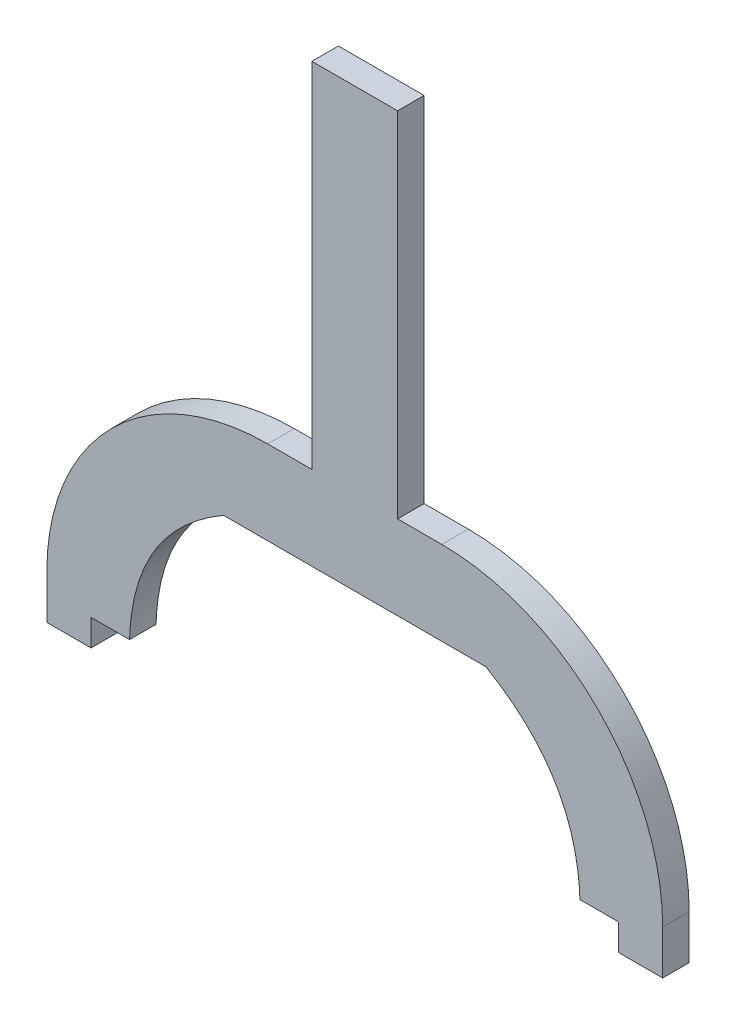
ISO-10303-21;
HEADER;
FILE_DESCRIPTION(('STEP AP214'),'2;1');
FILE_NAME('part.step','',(''),(''),'','','');
FILE_SCHEMA(('AUTOMOTIVE_DESIGN { 1 0 10303 214 1 1 1 1 }'));
ENDSEC;
DATA;
#1=APPLICATION_CONTEXT('core data for automotive mechanical design processes');
#2=APPLICATION_PROTOCOL_DEFINITION('international standard','automotive_design',2000,#1);
#3=PRODUCT_CONTEXT('',#1,'mechanical');
#4=PRODUCT('Part','Part','',(#3));
#5=PRODUCT_RELATED_PRODUCT_CATEGORY('part','',(#4));
#6=PRODUCT_DEFINITION_FORMATION('','',#4);
#7=PRODUCT_DEFINITION_CONTEXT('part definition',#1,'design');
#8=PRODUCT_DEFINITION('design','',#6,#7);
#9=PRODUCT_DEFINITION_SHAPE('','',#8);
#10=(LENGTH_UNIT() NAMED_UNIT(*) SI_UNIT(.MILLI.,.METRE.));
#11=(NAMED_UNIT(*) PLANE_ANGLE_UNIT() SI_UNIT($,.RADIAN.));
#12=(NAMED_UNIT(*) SI_UNIT($,.STERADIAN.) SOLID_ANGLE_UNIT());
#13=UNCERTAINTY_MEASURE_WITH_UNIT(LENGTH_MEASURE(1.E-05),#10,'distance_accuracy_value','');
#14=(GEOMETRIC_REPRESENTATION_CONTEXT(3) GLOBAL_UNCERTAINTY_ASSIGNED_CONTEXT((#13)) GLOBAL_UNIT_ASSIGNED_CONTEXT((#10,
#11,#12)) REPRESENTATION_CONTEXT('',''));
#15=CARTESIAN_POINT('',(0.,0.,0.));
#16=DIRECTION('',(0.,0.,1.));
#17=DIRECTION('',(1.,0.,0.));
#18=AXIS2_PLACEMENT_3D('',#15,#16,#17);
#19=CARTESIAN_POINT('',(37.7157739337465,-119.38,7.62));
#20=DIRECTION('',(0.,1.,0.));
#21=DIRECTION('',(0.,0.,1.));
#22=AXIS2_PLACEMENT_3D('',#19,#20,#21);
#23=PLANE('',#22);
#24=DIRECTION('',(0.,0.,1.));
#25=VECTOR('',#24,1.);
#26=CARTESIAN_POINT('',(64.7356154265762,-119.38,0.));
#27=LINE('',#26,#25);
#28=CARTESIAN_POINT('',(64.7356154265762,-119.38,0.));
#29=VERTEX_POINT('',#28);
#30=CARTESIAN_POINT('',(64.7356154265762,-119.38,7.62));
#31=VERTEX_POINT('',#30);
#32=EDGE_CURVE('E160',#29,#31,#27,.T.);
#33=ORIENTED_EDGE('',*,*,#32,.F.);
#34=DIRECTION('',(1.,0.,0.));
#35=VECTOR('',#34,1.);
#36=CARTESIAN_POINT('',(37.7157739337465,-119.38,0.));
#37=LINE('',#36,#35);
#38=CARTESIAN_POINT('',(75.8157739337465,-119.38,0.));
#39=VERTEX_POINT('',#38);
#40=EDGE_CURVE('E173',#29,#39,#37,.T.);
#41=ORIENTED_EDGE('',*,*,#40,.T.);
#42=DIRECTION('',(0.,0.,-1.));
#43=VECTOR('',#42,1.);
#44=CARTESIAN_POINT('',(75.8157739337465,-119.38,7.62));
#45=LINE('',#44,#43);
#46=CARTESIAN_POINT('',(75.8157739337465,-119.38,7.62));
#47=VERTEX_POINT('',#46);
#48=EDGE_CURVE('E207',#47,#39,#45,.T.);
#49=ORIENTED_EDGE('',*,*,#48,.F.);
#50=DIRECTION('',(1.,0.,0.));
#51=VECTOR('',#50,1.);
#52=CARTESIAN_POINT('',(37.7157739337465,-119.38,7.62));
#53=LINE('',#52,#51);
#54=EDGE_CURVE('E175',#31,#47,#53,.T.);
#55=ORIENTED_EDGE('',*,*,#54,.F.);
#56=EDGE_LOOP('',(#33,#41,#49,#55));
#57=FACE_BOUND('',#56,.T.);
#58=ADVANCED_FACE('F33',(#57),#23,.F.);
#59=CARTESIAN_POINT('',(0.,0.,7.62));
#60=DIRECTION('',(0.,0.,-1.));
#61=DIRECTION('',(-1.,0.,0.));
#62=AXIS2_PLACEMENT_3D('',#59,#60,#61);
#63=PLANE('',#62);
#64=CARTESIAN_POINT('',(37.7157739337465,-74.93,7.62));
#65=CARTESIAN_POINT('',(63.8441832928595,-90.0732647650582,7.62));
#66=CARTESIAN_POINT('',(64.7356154265762,-119.38,7.62));
#67=B_SPLINE_CURVE_WITH_KNOTS('',2,(#64,#65,#66),.UNSPECIFIED.,.F.,.F.,(3,3),(0.,1.),.UNSPECIFIED.);
#68=CARTESIAN_POINT('',(37.7157739337465,-74.93,7.62));
#69=VERTEX_POINT('',#68);
#70=EDGE_CURVE('E168',#69,#31,#67,.T.);
#71=ORIENTED_EDGE('',*,*,#70,.T.);
#72=ORIENTED_EDGE('',*,*,#54,.T.);
#73=DIRECTION('',(0.,-1.,0.));
#74=VECTOR('',#73,1.);
#75=CARTESIAN_POINT('',(75.8157739337465,-119.38,7.62));
#76=LINE('',#75,#74);
#77=CARTESIAN_POINT('',(75.8157739337465,-127.,7.62));
#78=VERTEX_POINT('',#77);
#79=EDGE_CURVE('E393',#47,#78,#76,.T.);
#80=ORIENTED_EDGE('',*,*,#79,.T.);
#81=DIRECTION('',(1.,0.,0.));
#82=VECTOR('',#81,1.);
#83=CARTESIAN_POINT('',(75.8157739337465,-127.,7.62));
#84=LINE('',#83,#82);
#85=CARTESIAN_POINT('',(88.5157739337465,-127.,7.62));
#86=VERTEX_POINT('',#85);
#87=EDGE_CURVE('E362',#78,#86,#84,.T.);
#88=ORIENTED_EDGE('',*,*,#87,.T.);
#89=DIRECTION('',(0.,1.,0.));
#90=VECTOR('',#89,1.);
#91=CARTESIAN_POINT('',(88.5157739337465,-50.8,7.62));
#92=LINE('',#91,#90);
#93=CARTESIAN_POINT('',(88.5157739337465,-114.3,7.62));
#94=VERTEX_POINT('',#93);
#95=EDGE_CURVE('E358',#86,#94,#92,.T.);
#96=ORIENTED_EDGE('',*,*,#95,.T.);
#97=CARTESIAN_POINT('',(25.0157739337465,-114.3,7.62));
#98=DIRECTION('',(0.,0.,-1.));
#99=DIRECTION('',(-1.,0.,0.));
#100=AXIS2_PLACEMENT_3D('',#97,#98,#99);
#101=CIRCLE('',#100,63.5);
#102=CARTESIAN_POINT('',(25.0157739337465,-50.8,7.62));
#103=VERTEX_POINT('',#102);
#104=EDGE_CURVE('E241',#94,#103,#101,.F.);
#105=ORIENTED_EDGE('',*,*,#104,.T.);
#106=DIRECTION('',(-1.,0.,0.));
#107=VECTOR('',#106,1.);
#108=CARTESIAN_POINT('',(12.3157739337465,-50.8,7.62));
#109=LINE('',#108,#107);
#110=CARTESIAN_POINT('',(12.3157739337465,-50.8,7.62));
#111=VERTEX_POINT('',#110);
#112=EDGE_CURVE('E201',#103,#111,#109,.T.);
#113=ORIENTED_EDGE('',*,*,#112,.T.);
#114=DIRECTION('',(0.,1.,0.));
#115=VECTOR('',#114,1.);
#116=CARTESIAN_POINT('',(12.3157739337465,-50.8,7.62));
#117=LINE('',#116,#115);
#118=CARTESIAN_POINT('',(12.3157739337465,50.8,7.62));
#119=VERTEX_POINT('',#118);
#120=EDGE_CURVE('E196',#111,#119,#117,.T.);
#121=ORIENTED_EDGE('',*,*,#120,.T.);
#122=DIRECTION('',(-1.,0.,0.));
#123=VECTOR('',#122,1.);
#124=CARTESIAN_POINT('',(-12.3157739337465,50.8,7.62));
#125=LINE('',#124,#123);
#126=CARTESIAN_POINT('',(-12.3157739337465,50.8,7.62));
#127=VERTEX_POINT('',#126);
#128=EDGE_CURVE('E380',#119,#127,#125,.T.);
#129=ORIENTED_EDGE('',*,*,#128,.T.);
#130=DIRECTION('',(0.,-1.,0.));
#131=VECTOR('',#130,1.);
#132=CARTESIAN_POINT('',(-12.3157739337465,-50.8,7.62));
#133=LINE('',#132,#131);
#134=CARTESIAN_POINT('',(-12.3157739337465,-50.8,7.62));
#135=VERTEX_POINT('',#134);
#136=EDGE_CURVE('E376',#127,#135,#133,.T.);
#137=ORIENTED_EDGE('',*,*,#136,.T.);
#138=DIRECTION('',(-1.,0.,0.));
#139=VECTOR('',#138,1.);
#140=CARTESIAN_POINT('',(-88.5157739337465,-50.8,7.62));
#141=LINE('',#140,#139);
#142=CARTESIAN_POINT('',(-25.0157739337465,-50.8,7.62));
#143=VERTEX_POINT('',#142);
#144=EDGE_CURVE('E375',#135,#143,#141,.T.);
#145=ORIENTED_EDGE('',*,*,#144,.T.);
#146=CARTESIAN_POINT('',(-25.0157739337465,-114.3,7.62));
#147=DIRECTION('',(0.,0.,-1.));
#148=DIRECTION('',(-1.,0.,0.));
#149=AXIS2_PLACEMENT_3D('',#146,#147,#148);
#150=CIRCLE('',#149,63.5);
#151=CARTESIAN_POINT('',(-88.5157739337465,-114.3,7.62));
#152=VERTEX_POINT('',#151);
#153=EDGE_CURVE('E56',#143,#152,#150,.F.);
#154=ORIENTED_EDGE('',*,*,#153,.T.);
#155=DIRECTION('',(0.,-1.,0.));
#156=VECTOR('',#155,1.);
#157=CARTESIAN_POINT('',(-88.5157739337465,-127.,7.62));
#158=LINE('',#157,#156);
#159=CARTESIAN_POINT('',(-88.5157739337465,-127.,7.62));
#160=VERTEX_POINT('',#159);
#161=EDGE_CURVE('E249',#152,#160,#158,.T.);
#162=ORIENTED_EDGE('',*,*,#161,.T.);
#163=DIRECTION('',(1.,0.,0.));
#164=VECTOR('',#163,1.);
#165=CARTESIAN_POINT('',(-88.5157739337465,-127.,7.62));
#166=LINE('',#165,#164);
#167=CARTESIAN_POINT('',(-75.8157739337465,-127.,7.62));
#168=VERTEX_POINT('',#167);
#169=EDGE_CURVE('E378',#160,#168,#166,.T.);
#170=ORIENTED_EDGE('',*,*,#169,.T.);
#171=DIRECTION('',(0.,1.,0.));
#172=VECTOR('',#171,1.);
#173=CARTESIAN_POINT('',(-75.8157739337465,-127.,7.62));
#174=LINE('',#173,#172);
#175=CARTESIAN_POINT('',(-75.8157739337465,-119.38,7.62));
#176=VERTEX_POINT('',#175);
#177=EDGE_CURVE('E385',#168,#176,#174,.T.);
#178=ORIENTED_EDGE('',*,*,#177,.T.);
#179=DIRECTION('',(1.,0.,0.));
#180=VECTOR('',#179,1.);
#181=CARTESIAN_POINT('',(-75.8157739337465,-119.38,7.62));
#182=LINE('',#181,#180);
#183=CARTESIAN_POINT('',(-64.7356154265761,-119.38,7.62));
#184=VERTEX_POINT('',#183);
#185=EDGE_CURVE('E387',#176,#184,#182,.T.);
#186=ORIENTED_EDGE('',*,*,#185,.T.);
#187=CARTESIAN_POINT('',(-37.7157739337465,-74.93,7.62));
#188=CARTESIAN_POINT('',(-63.8441832928595,-90.0732647650582,7.62));
#189=CARTESIAN_POINT('',(-64.7356154265761,-119.38,7.62));
#190=B_SPLINE_CURVE_WITH_KNOTS('',2,(#187,#188,#189),.UNSPECIFIED.,.F.,.F.,(3,3),(0.,1.),.UNSPECIFIED.);
#191=CARTESIAN_POINT('',(-37.7157739337465,-74.93,7.62));
#192=VERTEX_POINT('',#191);
#193=EDGE_CURVE('E176',#192,#184,#190,.T.);
#194=ORIENTED_EDGE('',*,*,#193,.F.);
#195=DIRECTION('',(1.,0.,0.));
#196=VECTOR('',#195,1.);
#197=CARTESIAN_POINT('',(37.7157739337465,-74.93,7.62));
#198=LINE('',#197,#196);
#199=EDGE_CURVE('E389',#192,#69,#198,.T.);
#200=ORIENTED_EDGE('',*,*,#199,.T.);
#201=EDGE_LOOP('',(#71,#72,#80,#88,#96,#105,#113,#121,#129,#137,#145,#154,#162,#170,#178,#186,
#194,#200));
#202=FACE_BOUND('',#201,.T.);
#203=ADVANCED_FACE('F290',(#202),#63,.F.);
#204=CARTESIAN_POINT('',(0.,0.,0.));
#205=DIRECTION('',(0.,0.,-1.));
#206=DIRECTION('',(-1.,0.,0.));
#207=AXIS2_PLACEMENT_3D('',#204,#205,#206);
#208=PLANE('',#207);
#209=ORIENTED_EDGE('',*,*,#40,.F.);
#210=CARTESIAN_POINT('',(37.7157739337465,-74.93,0.));
#211=CARTESIAN_POINT('',(63.8441832928595,-90.0732647650582,0.));
#212=CARTESIAN_POINT('',(64.7356154265762,-119.38,0.));
#213=B_SPLINE_CURVE_WITH_KNOTS('',2,(#210,#211,#212),.UNSPECIFIED.,.F.,.F.,(3,3),(0.,1.),.UNSPECIFIED.);
#214=CARTESIAN_POINT('',(37.7157739337465,-74.93,0.));
#215=VERTEX_POINT('',#214);
#216=EDGE_CURVE('E157',#215,#29,#213,.T.);
#217=ORIENTED_EDGE('',*,*,#216,.F.);
#218=DIRECTION('',(1.,0.,0.));
#219=VECTOR('',#218,1.);
#220=CARTESIAN_POINT('',(37.7157739337465,-74.93,0.));
#221=LINE('',#220,#219);
#222=CARTESIAN_POINT('',(-37.7157739337465,-74.93,0.));
#223=VERTEX_POINT('',#222);
#224=EDGE_CURVE('E182',#223,#215,#221,.T.);
#225=ORIENTED_EDGE('',*,*,#224,.F.);
#226=CARTESIAN_POINT('',(-37.7157739337465,-74.93,0.));
#227=CARTESIAN_POINT('',(-63.8441832928595,-90.0732647650582,0.));
#228=CARTESIAN_POINT('',(-64.7356154265761,-119.38,0.));
#229=B_SPLINE_CURVE_WITH_KNOTS('',2,(#226,#227,#228),.UNSPECIFIED.,.F.,.F.,(3,3),(0.,1.),.UNSPECIFIED.);
#230=CARTESIAN_POINT('',(-64.7356154265761,-119.38,0.));
#231=VERTEX_POINT('',#230);
#232=EDGE_CURVE('E271',#223,#231,#229,.T.);
#233=ORIENTED_EDGE('',*,*,#232,.T.);
#234=DIRECTION('',(1.,0.,0.));
#235=VECTOR('',#234,1.);
#236=CARTESIAN_POINT('',(-75.8157739337465,-119.38,0.));
#237=LINE('',#236,#235);
#238=CARTESIAN_POINT('',(-75.8157739337465,-119.38,0.));
#239=VERTEX_POINT('',#238);
#240=EDGE_CURVE('E186',#239,#231,#237,.T.);
#241=ORIENTED_EDGE('',*,*,#240,.F.);
#242=DIRECTION('',(0.,1.,0.));
#243=VECTOR('',#242,1.);
#244=CARTESIAN_POINT('',(-75.8157739337465,-127.,0.));
#245=LINE('',#244,#243);
#246=CARTESIAN_POINT('',(-75.8157739337465,-127.,0.));
#247=VERTEX_POINT('',#246);
#248=EDGE_CURVE('E258',#247,#239,#245,.T.);
#249=ORIENTED_EDGE('',*,*,#248,.F.);
#250=DIRECTION('',(1.,0.,0.));
#251=VECTOR('',#250,1.);
#252=CARTESIAN_POINT('',(-88.5157739337465,-127.,0.));
#253=LINE('',#252,#251);
#254=CARTESIAN_POINT('',(-88.5157739337465,-127.,0.));
#255=VERTEX_POINT('',#254);
#256=EDGE_CURVE('E255',#255,#247,#253,.T.);
#257=ORIENTED_EDGE('',*,*,#256,.F.);
#258=DIRECTION('',(0.,-1.,0.));
#259=VECTOR('',#258,1.);
#260=CARTESIAN_POINT('',(-88.5157739337465,-127.,0.));
#261=LINE('',#260,#259);
#262=CARTESIAN_POINT('',(-88.5157739337465,-114.3,0.));
#263=VERTEX_POINT('',#262);
#264=EDGE_CURVE('E248',#263,#255,#261,.T.);
#265=ORIENTED_EDGE('',*,*,#264,.F.);
#266=CARTESIAN_POINT('',(-25.0157739337465,-114.3,0.));
#267=DIRECTION('',(0.,0.,-1.));
#268=DIRECTION('',(-1.,0.,0.));
#269=AXIS2_PLACEMENT_3D('',#266,#267,#268);
#270=CIRCLE('',#269,63.5);
#271=CARTESIAN_POINT('',(-25.0157739337465,-50.8,0.));
#272=VERTEX_POINT('',#271);
#273=EDGE_CURVE('E234',#263,#272,#270,.T.);
#274=ORIENTED_EDGE('',*,*,#273,.T.);
#275=DIRECTION('',(-1.,0.,0.));
#276=VECTOR('',#275,1.);
#277=CARTESIAN_POINT('',(-88.5157739337465,-50.8,0.));
#278=LINE('',#277,#276);
#279=CARTESIAN_POINT('',(-12.3157739337465,-50.8,0.));
#280=VERTEX_POINT('',#279);
#281=EDGE_CURVE('E256',#280,#272,#278,.T.);
#282=ORIENTED_EDGE('',*,*,#281,.F.);
#283=DIRECTION('',(0.,-1.,0.));
#284=VECTOR('',#283,1.);
#285=CARTESIAN_POINT('',(-12.3157739337465,-50.8,0.));
#286=LINE('',#285,#284);
#287=CARTESIAN_POINT('',(-12.3157739337465,50.8,0.));
#288=VERTEX_POINT('',#287);
#289=EDGE_CURVE('E260',#288,#280,#286,.T.);
#290=ORIENTED_EDGE('',*,*,#289,.F.);
#291=DIRECTION('',(-1.,0.,0.));
#292=VECTOR('',#291,1.);
#293=CARTESIAN_POINT('',(-12.3157739337465,50.8,0.));
#294=LINE('',#293,#292);
#295=CARTESIAN_POINT('',(12.3157739337465,50.8,0.));
#296=VERTEX_POINT('',#295);
#297=EDGE_CURVE('E368',#296,#288,#294,.T.);
#298=ORIENTED_EDGE('',*,*,#297,.F.);
#299=DIRECTION('',(0.,1.,0.));
#300=VECTOR('',#299,1.);
#301=CARTESIAN_POINT('',(12.3157739337465,-50.8,0.));
#302=LINE('',#301,#300);
#303=CARTESIAN_POINT('',(12.3157739337465,-50.8,0.));
#304=VERTEX_POINT('',#303);
#305=EDGE_CURVE('E273',#304,#296,#302,.T.);
#306=ORIENTED_EDGE('',*,*,#305,.F.);
#307=DIRECTION('',(-1.,0.,0.));
#308=VECTOR('',#307,1.);
#309=CARTESIAN_POINT('',(12.3157739337465,-50.8,0.));
#310=LINE('',#309,#308);
#311=CARTESIAN_POINT('',(25.0157739337465,-50.8,0.));
#312=VERTEX_POINT('',#311);
#313=EDGE_CURVE('E194',#312,#304,#310,.T.);
#314=ORIENTED_EDGE('',*,*,#313,.F.);
#315=CARTESIAN_POINT('',(25.0157739337465,-114.3,0.));
#316=DIRECTION('',(0.,0.,-1.));
#317=DIRECTION('',(-1.,0.,0.));
#318=AXIS2_PLACEMENT_3D('',#315,#316,#317);
#319=CIRCLE('',#318,63.5);
#320=CARTESIAN_POINT('',(88.5157739337465,-114.3,0.));
#321=VERTEX_POINT('',#320);
#322=EDGE_CURVE('E236',#312,#321,#319,.T.);
#323=ORIENTED_EDGE('',*,*,#322,.T.);
#324=DIRECTION('',(0.,1.,0.));
#325=VECTOR('',#324,1.);
#326=CARTESIAN_POINT('',(88.5157739337465,-50.8,0.));
#327=LINE('',#326,#325);
#328=CARTESIAN_POINT('',(88.5157739337465,-127.,0.));
#329=VERTEX_POINT('',#328);
#330=EDGE_CURVE('E191',#329,#321,#327,.T.);
#331=ORIENTED_EDGE('',*,*,#330,.F.);
#332=DIRECTION('',(1.,0.,0.));
#333=VECTOR('',#332,1.);
#334=CARTESIAN_POINT('',(75.8157739337465,-127.,0.));
#335=LINE('',#334,#333);
#336=CARTESIAN_POINT('',(75.8157739337465,-127.,0.));
#337=VERTEX_POINT('',#336);
#338=EDGE_CURVE('E184',#337,#329,#335,.T.);
#339=ORIENTED_EDGE('',*,*,#338,.F.);
#340=DIRECTION('',(0.,-1.,0.));
#341=VECTOR('',#340,1.);
#342=CARTESIAN_POINT('',(75.8157739337465,-119.38,0.));
#343=LINE('',#342,#341);
#344=EDGE_CURVE('E181',#39,#337,#343,.T.);
#345=ORIENTED_EDGE('',*,*,#344,.F.);
#346=EDGE_LOOP('',(#209,#217,#225,#233,#241,#249,#257,#265,#274,#282,#290,#298,#306,#314,#323,
#331,#339,#345));
#347=FACE_BOUND('',#346,.T.);
#348=ADVANCED_FACE('F179',(#347),#208,.T.);
#349=CARTESIAN_POINT('',(12.3157739337465,-50.8,7.62));
#350=DIRECTION('',(-1.,0.,0.));
#351=DIRECTION('',(0.,0.,1.));
#352=AXIS2_PLACEMENT_3D('',#349,#350,#351);
#353=PLANE('',#352);
#354=ORIENTED_EDGE('',*,*,#305,.T.);
#355=DIRECTION('',(0.,0.,-1.));
#356=VECTOR('',#355,1.);
#357=CARTESIAN_POINT('',(12.3157739337465,50.8,7.62));
#358=LINE('',#357,#356);
#359=EDGE_CURVE('E228',#119,#296,#358,.T.);
#360=ORIENTED_EDGE('',*,*,#359,.F.);
#361=ORIENTED_EDGE('',*,*,#120,.F.);
#362=DIRECTION('',(0.,0.,-1.));
#363=VECTOR('',#362,1.);
#364=CARTESIAN_POINT('',(12.3157739337465,-50.8,7.62));
#365=LINE('',#364,#363);
#366=EDGE_CURVE('E197',#111,#304,#365,.T.);
#367=ORIENTED_EDGE('',*,*,#366,.T.);
#368=EDGE_LOOP('',(#354,#360,#361,#367));
#369=FACE_BOUND('',#368,.T.);
#370=ADVANCED_FACE('F295',(#369),#353,.F.);
#371=CARTESIAN_POINT('',(-12.3157739337465,50.8,7.62));
#372=DIRECTION('',(0.,-1.,0.));
#373=DIRECTION('',(0.,0.,-1.));
#374=AXIS2_PLACEMENT_3D('',#371,#372,#373);
#375=PLANE('',#374);
#376=ORIENTED_EDGE('',*,*,#297,.T.);
#377=DIRECTION('',(0.,0.,-1.));
#378=VECTOR('',#377,1.);
#379=CARTESIAN_POINT('',(-12.3157739337465,50.8,7.62));
#380=LINE('',#379,#378);
#381=EDGE_CURVE('E225',#127,#288,#380,.T.);
#382=ORIENTED_EDGE('',*,*,#381,.F.);
#383=ORIENTED_EDGE('',*,*,#128,.F.);
#384=ORIENTED_EDGE('',*,*,#359,.T.);
#385=EDGE_LOOP('',(#376,#382,#383,#384));
#386=FACE_BOUND('',#385,.T.);
#387=ADVANCED_FACE('F338',(#386),#375,.F.);
#388=CARTESIAN_POINT('',(-12.3157739337465,-50.8,7.62));
#389=DIRECTION('',(1.,0.,0.));
#390=DIRECTION('',(0.,0.,-1.));
#391=AXIS2_PLACEMENT_3D('',#388,#389,#390);
#392=PLANE('',#391);
#393=ORIENTED_EDGE('',*,*,#289,.T.);
#394=DIRECTION('',(0.,0.,-1.));
#395=VECTOR('',#394,1.);
#396=CARTESIAN_POINT('',(-12.3157739337465,-50.8,7.62));
#397=LINE('',#396,#395);
#398=EDGE_CURVE('E222',#135,#280,#397,.T.);
#399=ORIENTED_EDGE('',*,*,#398,.F.);
#400=ORIENTED_EDGE('',*,*,#136,.F.);
#401=ORIENTED_EDGE('',*,*,#381,.T.);
#402=EDGE_LOOP('',(#393,#399,#400,#401));
#403=FACE_BOUND('',#402,.T.);
#404=ADVANCED_FACE('F334',(#403),#392,.F.);
#405=CARTESIAN_POINT('',(-88.5157739337465,-50.8,7.62));
#406=DIRECTION('',(0.,-1.,0.));
#407=DIRECTION('',(0.,0.,-1.));
#408=AXIS2_PLACEMENT_3D('',#405,#406,#407);
#409=PLANE('',#408);
#410=ORIENTED_EDGE('',*,*,#281,.T.);
#411=DIRECTION('',(0.,0.,-1.));
#412=VECTOR('',#411,1.);
#413=CARTESIAN_POINT('',(-25.0157739337465,-50.8,7.62));
#414=LINE('',#413,#412);
#415=EDGE_CURVE('E11',#272,#143,#414,.F.);
#416=ORIENTED_EDGE('',*,*,#415,.T.);
#417=ORIENTED_EDGE('',*,*,#144,.F.);
#418=ORIENTED_EDGE('',*,*,#398,.T.);
#419=EDGE_LOOP('',(#410,#416,#417,#418));
#420=FACE_BOUND('',#419,.T.);
#421=ADVANCED_FACE('F331',(#420),#409,.F.);
#422=CARTESIAN_POINT('',(-88.5157739337465,-127.,7.62));
#423=DIRECTION('',(1.,0.,0.));
#424=DIRECTION('',(0.,0.,-1.));
#425=AXIS2_PLACEMENT_3D('',#422,#423,#424);
#426=PLANE('',#425);
#427=ORIENTED_EDGE('',*,*,#161,.F.);
#428=DIRECTION('',(0.,0.,-1.));
#429=VECTOR('',#428,1.);
#430=CARTESIAN_POINT('',(-88.5157739337465,-114.3,7.62));
#431=LINE('',#430,#429);
#432=EDGE_CURVE('E41',#152,#263,#431,.T.);
#433=ORIENTED_EDGE('',*,*,#432,.T.);
#434=ORIENTED_EDGE('',*,*,#264,.T.);
#435=DIRECTION('',(0.,0.,-1.));
#436=VECTOR('',#435,1.);
#437=CARTESIAN_POINT('',(-88.5157739337465,-127.,7.62));
#438=LINE('',#437,#436);
#439=EDGE_CURVE('E219',#160,#255,#438,.T.);
#440=ORIENTED_EDGE('',*,*,#439,.F.);
#441=EDGE_LOOP('',(#427,#433,#434,#440));
#442=FACE_BOUND('',#441,.T.);
#443=ADVANCED_FACE('F246',(#442),#426,.F.);
#444=CARTESIAN_POINT('',(-88.5157739337465,-127.,7.62));
#445=DIRECTION('',(0.,1.,0.));
#446=DIRECTION('',(0.,0.,1.));
#447=AXIS2_PLACEMENT_3D('',#444,#445,#446);
#448=PLANE('',#447);
#449=ORIENTED_EDGE('',*,*,#256,.T.);
#450=DIRECTION('',(0.,0.,-1.));
#451=VECTOR('',#450,1.);
#452=CARTESIAN_POINT('',(-75.8157739337465,-127.,7.62));
#453=LINE('',#452,#451);
#454=EDGE_CURVE('E216',#168,#247,#453,.T.);
#455=ORIENTED_EDGE('',*,*,#454,.F.);
#456=ORIENTED_EDGE('',*,*,#169,.F.);
#457=ORIENTED_EDGE('',*,*,#439,.T.);
#458=EDGE_LOOP('',(#449,#455,#456,#457));
#459=FACE_BOUND('',#458,.T.);
#460=ADVANCED_FACE('F324',(#459),#448,.F.);
#461=CARTESIAN_POINT('',(-75.8157739337465,-127.,7.62));
#462=DIRECTION('',(-1.,0.,0.));
#463=DIRECTION('',(0.,0.,1.));
#464=AXIS2_PLACEMENT_3D('',#461,#462,#463);
#465=PLANE('',#464);
#466=ORIENTED_EDGE('',*,*,#248,.T.);
#467=DIRECTION('',(0.,0.,-1.));
#468=VECTOR('',#467,1.);
#469=CARTESIAN_POINT('',(-75.8157739337465,-119.38,7.62));
#470=LINE('',#469,#468);
#471=EDGE_CURVE('E213',#176,#239,#470,.T.);
#472=ORIENTED_EDGE('',*,*,#471,.F.);
#473=ORIENTED_EDGE('',*,*,#177,.F.);
#474=ORIENTED_EDGE('',*,*,#454,.T.);
#475=EDGE_LOOP('',(#466,#472,#473,#474));
#476=FACE_BOUND('',#475,.T.);
#477=ADVANCED_FACE('F321',(#476),#465,.F.);
#478=CARTESIAN_POINT('',(-75.8157739337465,-119.38,7.62));
#479=DIRECTION('',(0.,1.,0.));
#480=DIRECTION('',(-1.,0.,0.));
#481=AXIS2_PLACEMENT_3D('',#478,#479,#480);
#482=PLANE('',#481);
#483=ORIENTED_EDGE('',*,*,#240,.T.);
#484=DIRECTION('',(0.,0.,1.));
#485=VECTOR('',#484,1.);
#486=CARTESIAN_POINT('',(-64.7356154265761,-119.38,0.));
#487=LINE('',#486,#485);
#488=EDGE_CURVE('E48',#231,#184,#487,.T.);
#489=ORIENTED_EDGE('',*,*,#488,.T.);
#490=ORIENTED_EDGE('',*,*,#185,.F.);
#491=ORIENTED_EDGE('',*,*,#471,.T.);
#492=EDGE_LOOP('',(#483,#489,#490,#491));
#493=FACE_BOUND('',#492,.T.);
#494=ADVANCED_FACE('F267',(#493),#482,.F.);
#495=CARTESIAN_POINT('',(37.7157739337465,-74.93,7.62));
#496=DIRECTION('',(0.,1.,0.));
#497=DIRECTION('',(-1.,0.,0.));
#498=AXIS2_PLACEMENT_3D('',#495,#496,#497);
#499=PLANE('',#498);
#500=ORIENTED_EDGE('',*,*,#224,.T.);
#501=DIRECTION('',(0.,0.,-1.));
#502=VECTOR('',#501,1.);
#503=CARTESIAN_POINT('',(37.7157739337465,-74.93,7.62));
#504=LINE('',#503,#502);
#505=EDGE_CURVE('E163',#69,#215,#504,.T.);
#506=ORIENTED_EDGE('',*,*,#505,.F.);
#507=ORIENTED_EDGE('',*,*,#199,.F.);
#508=DIRECTION('',(0.,0.,-1.));
#509=VECTOR('',#508,1.);
#510=CARTESIAN_POINT('',(-37.7157739337465,-74.93,7.62));
#511=LINE('',#510,#509);
#512=EDGE_CURVE('E210',#192,#223,#511,.T.);
#513=ORIENTED_EDGE('',*,*,#512,.T.);
#514=EDGE_LOOP('',(#500,#506,#507,#513));
#515=FACE_BOUND('',#514,.T.);
#516=ADVANCED_FACE('F312',(#515),#499,.F.);
#517=CARTESIAN_POINT('',(75.8157739337465,-119.38,7.62));
#518=DIRECTION('',(1.,0.,0.));
#519=DIRECTION('',(0.,1.,0.));
#520=AXIS2_PLACEMENT_3D('',#517,#518,#519);
#521=PLANE('',#520);
#522=ORIENTED_EDGE('',*,*,#344,.T.);
#523=DIRECTION('',(0.,0.,-1.));
#524=VECTOR('',#523,1.);
#525=CARTESIAN_POINT('',(75.8157739337465,-127.,7.62));
#526=LINE('',#525,#524);
#527=EDGE_CURVE('E204',#78,#337,#526,.T.);
#528=ORIENTED_EDGE('',*,*,#527,.F.);
#529=ORIENTED_EDGE('',*,*,#79,.F.);
#530=ORIENTED_EDGE('',*,*,#48,.T.);
#531=EDGE_LOOP('',(#522,#528,#529,#530));
#532=FACE_BOUND('',#531,.T.);
#533=ADVANCED_FACE('F308',(#532),#521,.F.);
#534=CARTESIAN_POINT('',(75.8157739337465,-127.,7.62));
#535=DIRECTION('',(0.,1.,0.));
#536=DIRECTION('',(0.,0.,1.));
#537=AXIS2_PLACEMENT_3D('',#534,#535,#536);
#538=PLANE('',#537);
#539=ORIENTED_EDGE('',*,*,#338,.T.);
#540=DIRECTION('',(0.,0.,-1.));
#541=VECTOR('',#540,1.);
#542=CARTESIAN_POINT('',(88.5157739337465,-127.,7.62));
#543=LINE('',#542,#541);
#544=EDGE_CURVE('E200',#86,#329,#543,.T.);
#545=ORIENTED_EDGE('',*,*,#544,.F.);
#546=ORIENTED_EDGE('',*,*,#87,.F.);
#547=ORIENTED_EDGE('',*,*,#527,.T.);
#548=EDGE_LOOP('',(#539,#545,#546,#547));
#549=FACE_BOUND('',#548,.T.);
#550=ADVANCED_FACE('F304',(#549),#538,.F.);
#551=CARTESIAN_POINT('',(88.5157739337465,-50.8,7.62));
#552=DIRECTION('',(-1.,0.,0.));
#553=DIRECTION('',(0.,-1.,0.));
#554=AXIS2_PLACEMENT_3D('',#551,#552,#553);
#555=PLANE('',#554);
#556=ORIENTED_EDGE('',*,*,#330,.T.);
#557=DIRECTION('',(0.,0.,-1.));
#558=VECTOR('',#557,1.);
#559=CARTESIAN_POINT('',(88.5157739337465,-114.3,7.62));
#560=LINE('',#559,#558);
#561=EDGE_CURVE('E238',#321,#94,#560,.F.);
#562=ORIENTED_EDGE('',*,*,#561,.T.);
#563=ORIENTED_EDGE('',*,*,#95,.F.);
#564=ORIENTED_EDGE('',*,*,#544,.T.);
#565=EDGE_LOOP('',(#556,#562,#563,#564));
#566=FACE_BOUND('',#565,.T.);
#567=ADVANCED_FACE('F300',(#566),#555,.F.);
#568=CARTESIAN_POINT('',(12.3157739337465,-50.8,7.62));
#569=DIRECTION('',(0.,-1.,0.));
#570=DIRECTION('',(0.,0.,-1.));
#571=AXIS2_PLACEMENT_3D('',#568,#569,#570);
#572=PLANE('',#571);
#573=ORIENTED_EDGE('',*,*,#112,.F.);
#574=DIRECTION('',(0.,0.,-1.));
#575=VECTOR('',#574,1.);
#576=CARTESIAN_POINT('',(25.0157739337465,-50.8,7.62));
#577=LINE('',#576,#575);
#578=EDGE_CURVE('E231',#103,#312,#577,.T.);
#579=ORIENTED_EDGE('',*,*,#578,.T.);
#580=ORIENTED_EDGE('',*,*,#313,.T.);
#581=ORIENTED_EDGE('',*,*,#366,.F.);
#582=EDGE_LOOP('',(#573,#579,#580,#581));
#583=FACE_BOUND('',#582,.T.);
#584=ADVANCED_FACE('F296',(#583),#572,.F.);
#585=CARTESIAN_POINT('',(25.0157739337465,-114.3,7.62));
#586=DIRECTION('',(0.,0.,-1.));
#587=DIRECTION('',(-1.,0.,0.));
#588=AXIS2_PLACEMENT_3D('',#585,#586,#587);
#589=CYLINDRICAL_SURFACE('',#588,63.5);
#590=ORIENTED_EDGE('',*,*,#104,.F.);
#591=ORIENTED_EDGE('',*,*,#561,.F.);
#592=ORIENTED_EDGE('',*,*,#322,.F.);
#593=ORIENTED_EDGE('',*,*,#578,.F.);
#594=EDGE_LOOP('',(#590,#591,#592,#593));
#595=FACE_BOUND('',#594,.T.);
#596=ADVANCED_FACE('F299',(#595),#589,.T.);
#597=CARTESIAN_POINT('',(-25.0157739337465,-114.3,7.62));
#598=DIRECTION('',(0.,0.,-1.));
#599=DIRECTION('',(-1.,0.,0.));
#600=AXIS2_PLACEMENT_3D('',#597,#598,#599);
#601=CYLINDRICAL_SURFACE('',#600,63.5);
#602=ORIENTED_EDGE('',*,*,#153,.F.);
#603=ORIENTED_EDGE('',*,*,#415,.F.);
#604=ORIENTED_EDGE('',*,*,#273,.F.);
#605=ORIENTED_EDGE('',*,*,#432,.F.);
#606=EDGE_LOOP('',(#602,#603,#604,#605));
#607=FACE_BOUND('',#606,.T.);
#608=ADVANCED_FACE('F35',(#607),#601,.T.);
#609=DIRECTION('',(0.,0.,1.));
#610=VECTOR('',#609,1.);
#611=SURFACE_OF_LINEAR_EXTRUSION('',#229,#610);
#612=ORIENTED_EDGE('',*,*,#193,.T.);
#613=ORIENTED_EDGE('',*,*,#488,.F.);
#614=ORIENTED_EDGE('',*,*,#232,.F.);
#615=ORIENTED_EDGE('',*,*,#512,.F.);
#616=EDGE_LOOP('',(#612,#613,#614,#615));
#617=FACE_BOUND('',#616,.T.);
#618=ADVANCED_FACE('F286',(#617),#611,.F.);
#619=DIRECTION('',(0.,0.,1.));
#620=VECTOR('',#619,1.);
#621=SURFACE_OF_LINEAR_EXTRUSION('',#213,#620);
#622=ORIENTED_EDGE('',*,*,#70,.F.);
#623=ORIENTED_EDGE('',*,*,#505,.T.);
#624=ORIENTED_EDGE('',*,*,#216,.T.);
#625=ORIENTED_EDGE('',*,*,#32,.T.);
#626=EDGE_LOOP('',(#622,#623,#624,#625));
#627=FACE_BOUND('',#626,.T.);
#628=ADVANCED_FACE('F159',(#627),#621,.T.);
#629=CLOSED_SHELL('',(#58,#203,#348,#370,#387,#404,#421,#443,#460,#477,#494,#516,#533,#550,#567,
#584,#596,#608,#618,#628));
#630=MANIFOLD_SOLID_BREP('B2',#629);
#631=ADVANCED_BREP_SHAPE_REPRESENTATION('',(#18,#630),#14);
#632=SHAPE_DEFINITION_REPRESENTATION(#9,#631);
ENDSEC;
END-ISO-10303-21;
